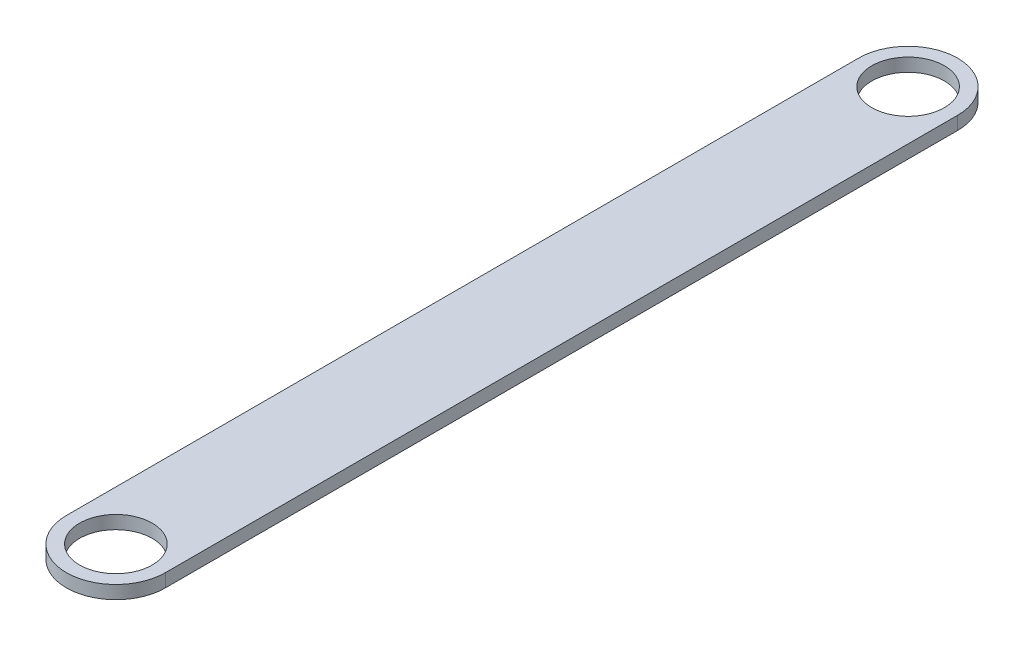
ISO-10303-21;
HEADER;
FILE_DESCRIPTION(('STEP AP214'),'2;1');
FILE_NAME('part.step','',(''),(''),'','','');
FILE_SCHEMA(('AUTOMOTIVE_DESIGN { 1 0 10303 214 1 1 1 1 }'));
ENDSEC;
DATA;
#1=APPLICATION_CONTEXT('core data for automotive mechanical design processes');
#2=APPLICATION_PROTOCOL_DEFINITION('international standard','automotive_design',2000,#1);
#3=PRODUCT_CONTEXT('',#1,'mechanical');
#4=PRODUCT('Part','Part','',(#3));
#5=PRODUCT_RELATED_PRODUCT_CATEGORY('part','',(#4));
#6=PRODUCT_DEFINITION_FORMATION('','',#4);
#7=PRODUCT_DEFINITION_CONTEXT('part definition',#1,'design');
#8=PRODUCT_DEFINITION('design','',#6,#7);
#9=PRODUCT_DEFINITION_SHAPE('','',#8);
#10=(LENGTH_UNIT() NAMED_UNIT(*) SI_UNIT(.MILLI.,.METRE.));
#11=(NAMED_UNIT(*) PLANE_ANGLE_UNIT() SI_UNIT($,.RADIAN.));
#12=(NAMED_UNIT(*) SI_UNIT($,.STERADIAN.) SOLID_ANGLE_UNIT());
#13=UNCERTAINTY_MEASURE_WITH_UNIT(LENGTH_MEASURE(1.E-05),#10,'distance_accuracy_value','');
#14=(GEOMETRIC_REPRESENTATION_CONTEXT(3) GLOBAL_UNCERTAINTY_ASSIGNED_CONTEXT((#13)) GLOBAL_UNIT_ASSIGNED_CONTEXT((#10,
#11,#12)) REPRESENTATION_CONTEXT('',''));
#15=CARTESIAN_POINT('',(0.,0.,0.));
#16=DIRECTION('',(0.,0.,1.));
#17=DIRECTION('',(1.,0.,0.));
#18=AXIS2_PLACEMENT_3D('',#15,#16,#17);
#19=CARTESIAN_POINT('',(0.,2.,0.));
#20=DIRECTION('',(0.,1.,0.));
#21=DIRECTION('',(0.,0.,1.));
#22=AXIS2_PLACEMENT_3D('',#19,#20,#21);
#23=PLANE('',#22);
#24=CARTESIAN_POINT('',(0.,2.,-120.));
#25=DIRECTION('',(0.,1.,0.));
#26=DIRECTION('',(0.,0.,1.));
#27=AXIS2_PLACEMENT_3D('',#24,#25,#26);
#28=CIRCLE('',#27,5.5);
#29=CARTESIAN_POINT('',(0.,2.,-114.5));
#30=VERTEX_POINT('',#29);
#31=EDGE_CURVE('E106',#30,#30,#28,.T.);
#32=ORIENTED_EDGE('',*,*,#31,.F.);
#33=EDGE_LOOP('',(#32));
#34=FACE_BOUND('',#33,.T.);
#35=CARTESIAN_POINT('',(0.,2.,0.));
#36=DIRECTION('',(0.,1.,0.));
#37=DIRECTION('',(0.,0.,1.));
#38=AXIS2_PLACEMENT_3D('',#35,#36,#37);
#39=CIRCLE('',#38,7.5);
#40=CARTESIAN_POINT('',(-7.5,2.,0.));
#41=VERTEX_POINT('',#40);
#42=CARTESIAN_POINT('',(7.5,2.,0.));
#43=VERTEX_POINT('',#42);
#44=EDGE_CURVE('E91',#41,#43,#39,.T.);
#45=ORIENTED_EDGE('',*,*,#44,.T.);
#46=DIRECTION('',(0.,0.,-1.));
#47=VECTOR('',#46,1.);
#48=CARTESIAN_POINT('',(7.5,2.,0.));
#49=LINE('',#48,#47);
#50=CARTESIAN_POINT('',(7.5,2.,-120.));
#51=VERTEX_POINT('',#50);
#52=EDGE_CURVE('E86',#43,#51,#49,.T.);
#53=ORIENTED_EDGE('',*,*,#52,.T.);
#54=CARTESIAN_POINT('',(0.,2.,-120.));
#55=DIRECTION('',(0.,1.,0.));
#56=DIRECTION('',(0.,0.,1.));
#57=AXIS2_PLACEMENT_3D('',#54,#55,#56);
#58=CIRCLE('',#57,7.5);
#59=CARTESIAN_POINT('',(-7.5,2.,-120.));
#60=VERTEX_POINT('',#59);
#61=EDGE_CURVE('E89',#51,#60,#58,.T.);
#62=ORIENTED_EDGE('',*,*,#61,.T.);
#63=DIRECTION('',(0.,0.,1.));
#64=VECTOR('',#63,1.);
#65=CARTESIAN_POINT('',(-7.5,2.,0.));
#66=LINE('',#65,#64);
#67=EDGE_CURVE('E56',#60,#41,#66,.T.);
#68=ORIENTED_EDGE('',*,*,#67,.T.);
#69=EDGE_LOOP('',(#45,#53,#62,#68));
#70=FACE_BOUND('',#69,.T.);
#71=CARTESIAN_POINT('',(0.,2.,0.));
#72=DIRECTION('',(0.,1.,0.));
#73=DIRECTION('',(0.,0.,1.));
#74=AXIS2_PLACEMENT_3D('',#71,#72,#73);
#75=CIRCLE('',#74,5.5);
#76=CARTESIAN_POINT('',(0.,2.,5.5));
#77=VERTEX_POINT('',#76);
#78=EDGE_CURVE('E121',#77,#77,#75,.T.);
#79=ORIENTED_EDGE('',*,*,#78,.F.);
#80=EDGE_LOOP('',(#79));
#81=FACE_BOUND('',#80,.T.);
#82=ADVANCED_FACE('F39',(#34,#70,#81),#23,.T.);
#83=CARTESIAN_POINT('',(0.,0.,0.));
#84=DIRECTION('',(0.,1.,0.));
#85=DIRECTION('',(0.,0.,1.));
#86=AXIS2_PLACEMENT_3D('',#83,#84,#85);
#87=PLANE('',#86);
#88=CARTESIAN_POINT('',(0.,0.,0.));
#89=DIRECTION('',(0.,1.,0.));
#90=DIRECTION('',(0.,0.,1.));
#91=AXIS2_PLACEMENT_3D('',#88,#89,#90);
#92=CIRCLE('',#91,7.5);
#93=CARTESIAN_POINT('',(-7.5,0.,0.));
#94=VERTEX_POINT('',#93);
#95=CARTESIAN_POINT('',(7.5,0.,0.));
#96=VERTEX_POINT('',#95);
#97=EDGE_CURVE('E103',#94,#96,#92,.T.);
#98=ORIENTED_EDGE('',*,*,#97,.F.);
#99=DIRECTION('',(0.,0.,1.));
#100=VECTOR('',#99,1.);
#101=CARTESIAN_POINT('',(-7.5,0.,0.));
#102=LINE('',#101,#100);
#103=CARTESIAN_POINT('',(-7.5,0.,-120.));
#104=VERTEX_POINT('',#103);
#105=EDGE_CURVE('E79',#104,#94,#102,.T.);
#106=ORIENTED_EDGE('',*,*,#105,.F.);
#107=CARTESIAN_POINT('',(0.,0.,-120.));
#108=DIRECTION('',(0.,1.,0.));
#109=DIRECTION('',(0.,0.,1.));
#110=AXIS2_PLACEMENT_3D('',#107,#108,#109);
#111=CIRCLE('',#110,7.5);
#112=CARTESIAN_POINT('',(7.5,0.,-120.));
#113=VERTEX_POINT('',#112);
#114=EDGE_CURVE('E73',#113,#104,#111,.T.);
#115=ORIENTED_EDGE('',*,*,#114,.F.);
#116=DIRECTION('',(0.,0.,-1.));
#117=VECTOR('',#116,1.);
#118=CARTESIAN_POINT('',(7.5,0.,0.));
#119=LINE('',#118,#117);
#120=EDGE_CURVE('E95',#96,#113,#119,.T.);
#121=ORIENTED_EDGE('',*,*,#120,.F.);
#122=EDGE_LOOP('',(#98,#106,#115,#121));
#123=FACE_BOUND('',#122,.T.);
#124=CARTESIAN_POINT('',(0.,0.,-120.));
#125=DIRECTION('',(0.,1.,0.));
#126=DIRECTION('',(0.,0.,1.));
#127=AXIS2_PLACEMENT_3D('',#124,#125,#126);
#128=CIRCLE('',#127,5.5);
#129=CARTESIAN_POINT('',(0.,0.,-114.5));
#130=VERTEX_POINT('',#129);
#131=EDGE_CURVE('E118',#130,#130,#128,.T.);
#132=ORIENTED_EDGE('',*,*,#131,.T.);
#133=EDGE_LOOP('',(#132));
#134=FACE_BOUND('',#133,.T.);
#135=CARTESIAN_POINT('',(0.,0.,0.));
#136=DIRECTION('',(0.,1.,0.));
#137=DIRECTION('',(0.,0.,1.));
#138=AXIS2_PLACEMENT_3D('',#135,#136,#137);
#139=CIRCLE('',#138,5.5);
#140=CARTESIAN_POINT('',(0.,0.,5.5));
#141=VERTEX_POINT('',#140);
#142=EDGE_CURVE('E124',#141,#141,#139,.T.);
#143=ORIENTED_EDGE('',*,*,#142,.T.);
#144=EDGE_LOOP('',(#143));
#145=FACE_BOUND('',#144,.T.);
#146=ADVANCED_FACE('F114',(#123,#134,#145),#87,.F.);
#147=CARTESIAN_POINT('',(0.,2.,0.));
#148=DIRECTION('',(0.,-1.,0.));
#149=DIRECTION('',(0.,0.,-1.));
#150=AXIS2_PLACEMENT_3D('',#147,#148,#149);
#151=CYLINDRICAL_SURFACE('',#150,7.5);
#152=ORIENTED_EDGE('',*,*,#97,.T.);
#153=DIRECTION('',(0.,-1.,0.));
#154=VECTOR('',#153,1.);
#155=CARTESIAN_POINT('',(7.5,2.,0.));
#156=LINE('',#155,#154);
#157=EDGE_CURVE('E11',#43,#96,#156,.T.);
#158=ORIENTED_EDGE('',*,*,#157,.F.);
#159=ORIENTED_EDGE('',*,*,#44,.F.);
#160=DIRECTION('',(0.,-1.,0.));
#161=VECTOR('',#160,1.);
#162=CARTESIAN_POINT('',(-7.5,2.,0.));
#163=LINE('',#162,#161);
#164=EDGE_CURVE('E99',#41,#94,#163,.T.);
#165=ORIENTED_EDGE('',*,*,#164,.T.);
#166=EDGE_LOOP('',(#152,#158,#159,#165));
#167=FACE_BOUND('',#166,.T.);
#168=ADVANCED_FACE('F41',(#167),#151,.T.);
#169=CARTESIAN_POINT('',(7.5,2.,0.));
#170=DIRECTION('',(-1.,0.,0.));
#171=DIRECTION('',(0.,0.,1.));
#172=AXIS2_PLACEMENT_3D('',#169,#170,#171);
#173=PLANE('',#172);
#174=ORIENTED_EDGE('',*,*,#120,.T.);
#175=DIRECTION('',(0.,-1.,0.));
#176=VECTOR('',#175,1.);
#177=CARTESIAN_POINT('',(7.5,2.,-120.));
#178=LINE('',#177,#176);
#179=EDGE_CURVE('E48',#51,#113,#178,.T.);
#180=ORIENTED_EDGE('',*,*,#179,.F.);
#181=ORIENTED_EDGE('',*,*,#52,.F.);
#182=ORIENTED_EDGE('',*,*,#157,.T.);
#183=EDGE_LOOP('',(#174,#180,#181,#182));
#184=FACE_BOUND('',#183,.T.);
#185=ADVANCED_FACE('F94',(#184),#173,.F.);
#186=CARTESIAN_POINT('',(0.,2.,-120.));
#187=DIRECTION('',(0.,-1.,0.));
#188=DIRECTION('',(0.,0.,-1.));
#189=AXIS2_PLACEMENT_3D('',#186,#187,#188);
#190=CYLINDRICAL_SURFACE('',#189,7.5);
#191=ORIENTED_EDGE('',*,*,#114,.T.);
#192=DIRECTION('',(0.,-1.,0.));
#193=VECTOR('',#192,1.);
#194=CARTESIAN_POINT('',(-7.5,2.,-120.));
#195=LINE('',#194,#193);
#196=EDGE_CURVE('E96',#60,#104,#195,.T.);
#197=ORIENTED_EDGE('',*,*,#196,.F.);
#198=ORIENTED_EDGE('',*,*,#61,.F.);
#199=ORIENTED_EDGE('',*,*,#179,.T.);
#200=EDGE_LOOP('',(#191,#197,#198,#199));
#201=FACE_BOUND('',#200,.T.);
#202=ADVANCED_FACE('F97',(#201),#190,.T.);
#203=CARTESIAN_POINT('',(-7.5,2.,0.));
#204=DIRECTION('',(1.,0.,0.));
#205=DIRECTION('',(0.,0.,-1.));
#206=AXIS2_PLACEMENT_3D('',#203,#204,#205);
#207=PLANE('',#206);
#208=ORIENTED_EDGE('',*,*,#105,.T.);
#209=ORIENTED_EDGE('',*,*,#164,.F.);
#210=ORIENTED_EDGE('',*,*,#67,.F.);
#211=ORIENTED_EDGE('',*,*,#196,.T.);
#212=EDGE_LOOP('',(#208,#209,#210,#211));
#213=FACE_BOUND('',#212,.T.);
#214=ADVANCED_FACE('F111',(#213),#207,.F.);
#215=CARTESIAN_POINT('',(0.,2.,-120.));
#216=DIRECTION('',(0.,-1.,0.));
#217=DIRECTION('',(0.,0.,-1.));
#218=AXIS2_PLACEMENT_3D('',#215,#216,#217);
#219=CYLINDRICAL_SURFACE('',#218,5.5);
#220=ORIENTED_EDGE('',*,*,#31,.T.);
#221=EDGE_LOOP('',(#220));
#222=FACE_BOUND('',#221,.T.);
#223=ORIENTED_EDGE('',*,*,#131,.F.);
#224=EDGE_LOOP('',(#223));
#225=FACE_BOUND('',#224,.T.);
#226=ADVANCED_FACE('F141',(#222,#225),#219,.F.);
#227=CARTESIAN_POINT('',(0.,2.,0.));
#228=DIRECTION('',(0.,-1.,0.));
#229=DIRECTION('',(0.,0.,-1.));
#230=AXIS2_PLACEMENT_3D('',#227,#228,#229);
#231=CYLINDRICAL_SURFACE('',#230,5.5);
#232=ORIENTED_EDGE('',*,*,#78,.T.);
#233=EDGE_LOOP('',(#232));
#234=FACE_BOUND('',#233,.T.);
#235=ORIENTED_EDGE('',*,*,#142,.F.);
#236=EDGE_LOOP('',(#235));
#237=FACE_BOUND('',#236,.T.);
#238=ADVANCED_FACE('F130',(#234,#237),#231,.F.);
#239=CLOSED_SHELL('',(#82,#146,#168,#185,#202,#214,#226,#238));
#240=MANIFOLD_SOLID_BREP('B2',#239);
#241=ADVANCED_BREP_SHAPE_REPRESENTATION('',(#18,#240),#14);
#242=SHAPE_DEFINITION_REPRESENTATION(#9,#241);
ENDSEC;
END-ISO-10303-21;
